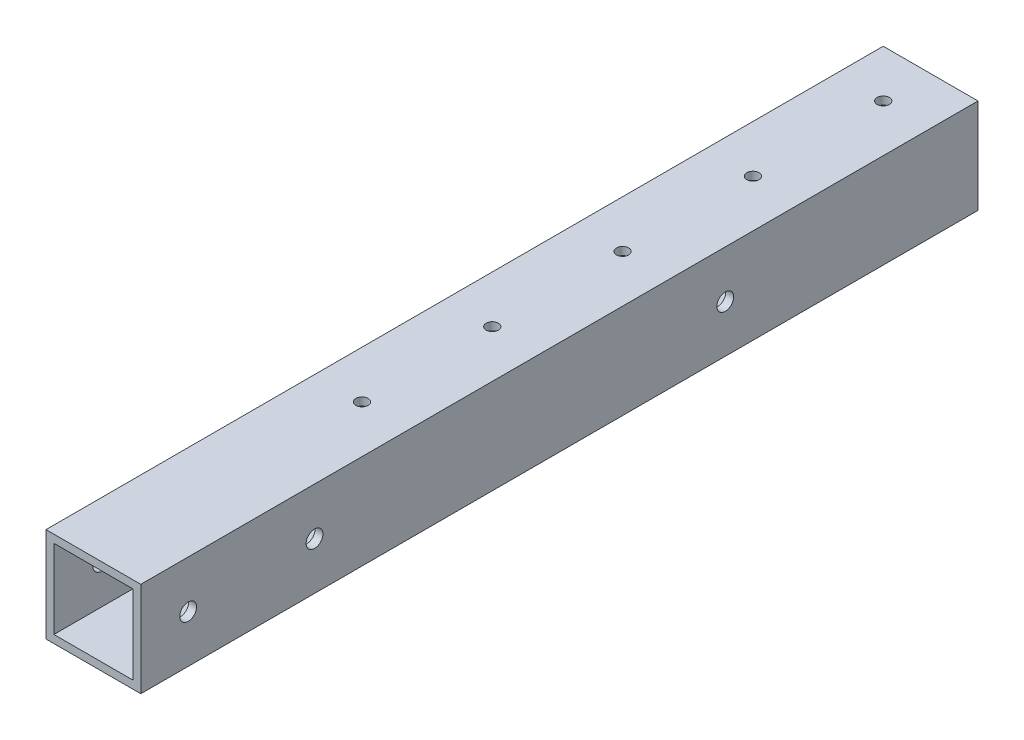
ISO-10303-21;
HEADER;
FILE_DESCRIPTION(('STEP AP214'),'2;1');
FILE_NAME('part.step','',(''),(''),'','','');
FILE_SCHEMA(('AUTOMOTIVE_DESIGN { 1 0 10303 214 1 1 1 1 }'));
ENDSEC;
DATA;
#1=APPLICATION_CONTEXT('core data for automotive mechanical design processes');
#2=APPLICATION_PROTOCOL_DEFINITION('international standard','automotive_design',2000,#1);
#3=PRODUCT_CONTEXT('',#1,'mechanical');
#4=PRODUCT('Part','Part','',(#3));
#5=PRODUCT_RELATED_PRODUCT_CATEGORY('part','',(#4));
#6=PRODUCT_DEFINITION_FORMATION('','',#4);
#7=PRODUCT_DEFINITION_CONTEXT('part definition',#1,'design');
#8=PRODUCT_DEFINITION('design','',#6,#7);
#9=PRODUCT_DEFINITION_SHAPE('','',#8);
#10=(LENGTH_UNIT() NAMED_UNIT(*) SI_UNIT(.MILLI.,.METRE.));
#11=(NAMED_UNIT(*) PLANE_ANGLE_UNIT() SI_UNIT($,.RADIAN.));
#12=(NAMED_UNIT(*) SI_UNIT($,.STERADIAN.) SOLID_ANGLE_UNIT());
#13=UNCERTAINTY_MEASURE_WITH_UNIT(LENGTH_MEASURE(1.E-05),#10,'distance_accuracy_value','');
#14=(GEOMETRIC_REPRESENTATION_CONTEXT(3) GLOBAL_UNCERTAINTY_ASSIGNED_CONTEXT((#13)) GLOBAL_UNIT_ASSIGNED_CONTEXT((#10,
#11,#12)) REPRESENTATION_CONTEXT('',''));
#15=CARTESIAN_POINT('',(0.,0.,0.));
#16=DIRECTION('',(0.,0.,1.));
#17=DIRECTION('',(1.,0.,0.));
#18=AXIS2_PLACEMENT_3D('',#15,#16,#17);
#19=CARTESIAN_POINT('',(19.05,-19.05,-171.45));
#20=DIRECTION('',(1.,0.,0.));
#21=DIRECTION('',(0.,0.,-1.));
#22=AXIS2_PLACEMENT_3D('',#19,#20,#21);
#23=PLANE('',#22);
#24=CARTESIAN_POINT('',(19.05,0.,146.05));
#25=DIRECTION('',(1.,0.,0.));
#26=DIRECTION('',(0.,0.,-1.));
#27=AXIS2_PLACEMENT_3D('',#24,#25,#26);
#28=CIRCLE('',#27,3.37819999999999);
#29=CARTESIAN_POINT('',(19.05,0.,142.6718));
#30=VERTEX_POINT('',#29);
#31=EDGE_CURVE('E284',#30,#30,#28,.T.);
#32=ORIENTED_EDGE('',*,*,#31,.F.);
#33=EDGE_LOOP('',(#32));
#34=FACE_BOUND('',#33,.T.);
#35=CARTESIAN_POINT('',(19.05,0.,-69.85));
#36=DIRECTION('',(1.,0.,0.));
#37=DIRECTION('',(0.,0.,-1.));
#38=AXIS2_PLACEMENT_3D('',#35,#36,#37);
#39=CIRCLE('',#38,3.37819999999999);
#40=CARTESIAN_POINT('',(19.05,0.,-73.2282));
#41=VERTEX_POINT('',#40);
#42=EDGE_CURVE('E294',#41,#41,#39,.T.);
#43=ORIENTED_EDGE('',*,*,#42,.F.);
#44=EDGE_LOOP('',(#43));
#45=FACE_BOUND('',#44,.T.);
#46=CARTESIAN_POINT('',(19.05,0.,95.25));
#47=DIRECTION('',(1.,0.,0.));
#48=DIRECTION('',(0.,0.,-1.));
#49=AXIS2_PLACEMENT_3D('',#46,#47,#48);
#50=CIRCLE('',#49,3.37819999999999);
#51=CARTESIAN_POINT('',(19.05,0.,91.8718));
#52=VERTEX_POINT('',#51);
#53=EDGE_CURVE('E304',#52,#52,#50,.T.);
#54=ORIENTED_EDGE('',*,*,#53,.F.);
#55=EDGE_LOOP('',(#54));
#56=FACE_BOUND('',#55,.T.);
#57=DIRECTION('',(0.,0.,1.));
#58=VECTOR('',#57,1.);
#59=CARTESIAN_POINT('',(19.05,19.05,-171.45));
#60=LINE('',#59,#58);
#61=CARTESIAN_POINT('',(19.05,19.05,-171.45));
#62=VERTEX_POINT('',#61);
#63=CARTESIAN_POINT('',(19.05,19.05,165.1));
#64=VERTEX_POINT('',#63);
#65=EDGE_CURVE('E187',#62,#64,#60,.T.);
#66=ORIENTED_EDGE('',*,*,#65,.T.);
#67=DIRECTION('',(0.,1.,0.));
#68=VECTOR('',#67,1.);
#69=CARTESIAN_POINT('',(19.05,-19.05,165.1));
#70=LINE('',#69,#68);
#71=CARTESIAN_POINT('',(19.05,-19.05,165.1));
#72=VERTEX_POINT('',#71);
#73=EDGE_CURVE('E140',#72,#64,#70,.T.);
#74=ORIENTED_EDGE('',*,*,#73,.F.);
#75=DIRECTION('',(0.,0.,1.));
#76=VECTOR('',#75,1.);
#77=CARTESIAN_POINT('',(19.05,-19.05,-171.45));
#78=LINE('',#77,#76);
#79=CARTESIAN_POINT('',(19.05,-19.05,-171.45));
#80=VERTEX_POINT('',#79);
#81=EDGE_CURVE('E11',#80,#72,#78,.T.);
#82=ORIENTED_EDGE('',*,*,#81,.F.);
#83=DIRECTION('',(0.,1.,0.));
#84=VECTOR('',#83,1.);
#85=CARTESIAN_POINT('',(19.05,-19.05,-171.45));
#86=LINE('',#85,#84);
#87=EDGE_CURVE('E168',#80,#62,#86,.T.);
#88=ORIENTED_EDGE('',*,*,#87,.T.);
#89=EDGE_LOOP('',(#66,#74,#82,#88));
#90=FACE_BOUND('',#89,.T.);
#91=ADVANCED_FACE('F36',(#34,#45,#56,#90),#23,.T.);
#92=CARTESIAN_POINT('',(-19.05,-19.05,-171.45));
#93=DIRECTION('',(0.,-1.,0.));
#94=DIRECTION('',(0.,0.,-1.));
#95=AXIS2_PLACEMENT_3D('',#92,#93,#94);
#96=PLANE('',#95);
#97=CARTESIAN_POINT('',(0.,-19.05,-152.4));
#98=DIRECTION('',(0.,1.,0.));
#99=DIRECTION('',(0.,0.,1.));
#100=AXIS2_PLACEMENT_3D('',#97,#98,#99);
#101=CIRCLE('',#100,2.45744999999998);
#102=CARTESIAN_POINT('',(0.,-19.05,-149.94255));
#103=VERTEX_POINT('',#102);
#104=EDGE_CURVE('E531',#103,#103,#101,.T.);
#105=ORIENTED_EDGE('',*,*,#104,.T.);
#106=EDGE_LOOP('',(#105));
#107=FACE_BOUND('',#106,.T.);
#108=CARTESIAN_POINT('',(1.73472347597681E-13,-19.05,-100.0125));
#109=DIRECTION('',(0.,1.,0.));
#110=DIRECTION('',(0.,0.,1.));
#111=AXIS2_PLACEMENT_3D('',#108,#109,#110);
#112=CIRCLE('',#111,2.45744999999998);
#113=CARTESIAN_POINT('',(1.73472347597681E-13,-19.05,-97.55505));
#114=VERTEX_POINT('',#113);
#115=EDGE_CURVE('E234',#114,#114,#112,.T.);
#116=ORIENTED_EDGE('',*,*,#115,.T.);
#117=EDGE_LOOP('',(#116));
#118=FACE_BOUND('',#117,.T.);
#119=CARTESIAN_POINT('',(0.,-19.05,-47.6249999999998));
#120=DIRECTION('',(0.,1.,0.));
#121=DIRECTION('',(0.,0.,1.));
#122=AXIS2_PLACEMENT_3D('',#119,#120,#121);
#123=CIRCLE('',#122,2.45744999999998);
#124=CARTESIAN_POINT('',(0.,-19.05,-45.1675499999998));
#125=VERTEX_POINT('',#124);
#126=EDGE_CURVE('E229',#125,#125,#123,.T.);
#127=ORIENTED_EDGE('',*,*,#126,.T.);
#128=EDGE_LOOP('',(#127));
#129=FACE_BOUND('',#128,.T.);
#130=CARTESIAN_POINT('',(1.31838984174237E-13,-19.05,4.76249999999998));
#131=DIRECTION('',(0.,1.,0.));
#132=DIRECTION('',(0.,0.,1.));
#133=AXIS2_PLACEMENT_3D('',#130,#131,#132);
#134=CIRCLE('',#133,2.45744999999998);
#135=CARTESIAN_POINT('',(1.31838984174237E-13,-19.05,7.21994999999996));
#136=VERTEX_POINT('',#135);
#137=EDGE_CURVE('E224',#136,#136,#134,.T.);
#138=ORIENTED_EDGE('',*,*,#137,.T.);
#139=EDGE_LOOP('',(#138));
#140=FACE_BOUND('',#139,.T.);
#141=CARTESIAN_POINT('',(0.,-19.05,57.15));
#142=DIRECTION('',(0.,1.,0.));
#143=DIRECTION('',(0.,0.,1.));
#144=AXIS2_PLACEMENT_3D('',#141,#142,#143);
#145=CIRCLE('',#144,2.45744999999998);
#146=CARTESIAN_POINT('',(0.,-19.05,59.60745));
#147=VERTEX_POINT('',#146);
#148=EDGE_CURVE('E218',#147,#147,#145,.T.);
#149=ORIENTED_EDGE('',*,*,#148,.T.);
#150=EDGE_LOOP('',(#149));
#151=FACE_BOUND('',#150,.T.);
#152=ORIENTED_EDGE('',*,*,#81,.T.);
#153=DIRECTION('',(1.,0.,0.));
#154=VECTOR('',#153,1.);
#155=CARTESIAN_POINT('',(-19.05,-19.05,165.1));
#156=LINE('',#155,#154);
#157=CARTESIAN_POINT('',(-19.05,-19.05,165.1));
#158=VERTEX_POINT('',#157);
#159=EDGE_CURVE('E152',#158,#72,#156,.T.);
#160=ORIENTED_EDGE('',*,*,#159,.F.);
#161=DIRECTION('',(0.,0.,1.));
#162=VECTOR('',#161,1.);
#163=CARTESIAN_POINT('',(-19.05,-19.05,-171.45));
#164=LINE('',#163,#162);
#165=CARTESIAN_POINT('',(-19.05,-19.05,-171.45));
#166=VERTEX_POINT('',#165);
#167=EDGE_CURVE('E45',#166,#158,#164,.T.);
#168=ORIENTED_EDGE('',*,*,#167,.F.);
#169=DIRECTION('',(1.,0.,0.));
#170=VECTOR('',#169,1.);
#171=CARTESIAN_POINT('',(-19.05,-19.05,-171.45));
#172=LINE('',#171,#170);
#173=EDGE_CURVE('E184',#166,#80,#172,.T.);
#174=ORIENTED_EDGE('',*,*,#173,.T.);
#175=EDGE_LOOP('',(#152,#160,#168,#174));
#176=FACE_BOUND('',#175,.T.);
#177=ADVANCED_FACE('F332',(#107,#118,#129,#140,#151,#176),#96,.T.);
#178=CARTESIAN_POINT('',(-19.05,-19.05,-171.45));
#179=DIRECTION('',(-1.,0.,0.));
#180=DIRECTION('',(0.,0.,1.));
#181=AXIS2_PLACEMENT_3D('',#178,#179,#180);
#182=PLANE('',#181);
#183=CARTESIAN_POINT('',(-19.05,0.,146.05));
#184=DIRECTION('',(1.,0.,0.));
#185=DIRECTION('',(0.,0.,-1.));
#186=AXIS2_PLACEMENT_3D('',#183,#184,#185);
#187=CIRCLE('',#186,3.37819999999999);
#188=CARTESIAN_POINT('',(-19.05,0.,142.6718));
#189=VERTEX_POINT('',#188);
#190=EDGE_CURVE('E212',#189,#189,#187,.T.);
#191=ORIENTED_EDGE('',*,*,#190,.T.);
#192=EDGE_LOOP('',(#191));
#193=FACE_BOUND('',#192,.T.);
#194=CARTESIAN_POINT('',(-19.05,0.,-69.85));
#195=DIRECTION('',(1.,0.,0.));
#196=DIRECTION('',(0.,0.,-1.));
#197=AXIS2_PLACEMENT_3D('',#194,#195,#196);
#198=CIRCLE('',#197,3.37819999999999);
#199=CARTESIAN_POINT('',(-19.05,0.,-73.2282));
#200=VERTEX_POINT('',#199);
#201=EDGE_CURVE('E206',#200,#200,#198,.T.);
#202=ORIENTED_EDGE('',*,*,#201,.T.);
#203=EDGE_LOOP('',(#202));
#204=FACE_BOUND('',#203,.T.);
#205=CARTESIAN_POINT('',(-19.05,0.,95.25));
#206=DIRECTION('',(1.,0.,0.));
#207=DIRECTION('',(0.,0.,-1.));
#208=AXIS2_PLACEMENT_3D('',#205,#206,#207);
#209=CIRCLE('',#208,3.37819999999999);
#210=CARTESIAN_POINT('',(-19.05,0.,91.8718));
#211=VERTEX_POINT('',#210);
#212=EDGE_CURVE('E200',#211,#211,#209,.T.);
#213=ORIENTED_EDGE('',*,*,#212,.T.);
#214=EDGE_LOOP('',(#213));
#215=FACE_BOUND('',#214,.T.);
#216=ORIENTED_EDGE('',*,*,#167,.T.);
#217=DIRECTION('',(0.,-1.,0.));
#218=VECTOR('',#217,1.);
#219=CARTESIAN_POINT('',(-19.05,-19.05,165.1));
#220=LINE('',#219,#218);
#221=CARTESIAN_POINT('',(-19.05,19.05,165.1));
#222=VERTEX_POINT('',#221);
#223=EDGE_CURVE('E148',#222,#158,#220,.T.);
#224=ORIENTED_EDGE('',*,*,#223,.F.);
#225=DIRECTION('',(0.,0.,1.));
#226=VECTOR('',#225,1.);
#227=CARTESIAN_POINT('',(-19.05,19.05,-171.45));
#228=LINE('',#227,#226);
#229=CARTESIAN_POINT('',(-19.05,19.05,-171.45));
#230=VERTEX_POINT('',#229);
#231=EDGE_CURVE('E191',#230,#222,#228,.T.);
#232=ORIENTED_EDGE('',*,*,#231,.F.);
#233=DIRECTION('',(0.,-1.,0.));
#234=VECTOR('',#233,1.);
#235=CARTESIAN_POINT('',(-19.05,-19.05,-171.45));
#236=LINE('',#235,#234);
#237=EDGE_CURVE('E180',#230,#166,#236,.T.);
#238=ORIENTED_EDGE('',*,*,#237,.T.);
#239=EDGE_LOOP('',(#216,#224,#232,#238));
#240=FACE_BOUND('',#239,.T.);
#241=ADVANCED_FACE('F337',(#193,#204,#215,#240),#182,.T.);
#242=CARTESIAN_POINT('',(-19.05,19.05,-171.45));
#243=DIRECTION('',(0.,1.,0.));
#244=DIRECTION('',(0.,0.,1.));
#245=AXIS2_PLACEMENT_3D('',#242,#243,#244);
#246=PLANE('',#245);
#247=CARTESIAN_POINT('',(0.,19.05,-152.4));
#248=DIRECTION('',(0.,1.,0.));
#249=DIRECTION('',(0.,0.,1.));
#250=AXIS2_PLACEMENT_3D('',#247,#248,#249);
#251=CIRCLE('',#250,2.45744999999999);
#252=CARTESIAN_POINT('',(0.,19.05,-149.94255));
#253=VERTEX_POINT('',#252);
#254=EDGE_CURVE('E541',#253,#253,#251,.T.);
#255=ORIENTED_EDGE('',*,*,#254,.F.);
#256=EDGE_LOOP('',(#255));
#257=FACE_BOUND('',#256,.T.);
#258=CARTESIAN_POINT('',(1.73472347597681E-13,19.05,-100.0125));
#259=DIRECTION('',(0.,1.,0.));
#260=DIRECTION('',(0.,0.,1.));
#261=AXIS2_PLACEMENT_3D('',#258,#259,#260);
#262=CIRCLE('',#261,2.45744999999999);
#263=CARTESIAN_POINT('',(1.73472347597681E-13,19.05,-97.55505));
#264=VERTEX_POINT('',#263);
#265=EDGE_CURVE('E244',#264,#264,#262,.T.);
#266=ORIENTED_EDGE('',*,*,#265,.F.);
#267=EDGE_LOOP('',(#266));
#268=FACE_BOUND('',#267,.T.);
#269=CARTESIAN_POINT('',(0.,19.05,-47.6249999999998));
#270=DIRECTION('',(0.,1.,0.));
#271=DIRECTION('',(0.,0.,1.));
#272=AXIS2_PLACEMENT_3D('',#269,#270,#271);
#273=CIRCLE('',#272,2.45744999999999);
#274=CARTESIAN_POINT('',(0.,19.05,-45.1675499999998));
#275=VERTEX_POINT('',#274);
#276=EDGE_CURVE('E241',#275,#275,#273,.T.);
#277=ORIENTED_EDGE('',*,*,#276,.F.);
#278=EDGE_LOOP('',(#277));
#279=FACE_BOUND('',#278,.T.);
#280=CARTESIAN_POINT('',(1.31838984174237E-13,19.05,4.76249999999998));
#281=DIRECTION('',(0.,1.,0.));
#282=DIRECTION('',(0.,0.,1.));
#283=AXIS2_PLACEMENT_3D('',#280,#281,#282);
#284=CIRCLE('',#283,2.45744999999999);
#285=CARTESIAN_POINT('',(1.31838984174237E-13,19.05,7.21994999999996));
#286=VERTEX_POINT('',#285);
#287=EDGE_CURVE('E264',#286,#286,#284,.T.);
#288=ORIENTED_EDGE('',*,*,#287,.F.);
#289=EDGE_LOOP('',(#288));
#290=FACE_BOUND('',#289,.T.);
#291=CARTESIAN_POINT('',(0.,19.05,57.15));
#292=DIRECTION('',(0.,1.,0.));
#293=DIRECTION('',(0.,0.,1.));
#294=AXIS2_PLACEMENT_3D('',#291,#292,#293);
#295=CIRCLE('',#294,2.45744999999999);
#296=CARTESIAN_POINT('',(0.,19.05,59.60745));
#297=VERTEX_POINT('',#296);
#298=EDGE_CURVE('E274',#297,#297,#295,.T.);
#299=ORIENTED_EDGE('',*,*,#298,.F.);
#300=EDGE_LOOP('',(#299));
#301=FACE_BOUND('',#300,.T.);
#302=ORIENTED_EDGE('',*,*,#231,.T.);
#303=DIRECTION('',(-1.,0.,0.));
#304=VECTOR('',#303,1.);
#305=CARTESIAN_POINT('',(-19.05,19.05,165.1));
#306=LINE('',#305,#304);
#307=EDGE_CURVE('E144',#64,#222,#306,.T.);
#308=ORIENTED_EDGE('',*,*,#307,.F.);
#309=ORIENTED_EDGE('',*,*,#65,.F.);
#310=DIRECTION('',(-1.,0.,0.));
#311=VECTOR('',#310,1.);
#312=CARTESIAN_POINT('',(-19.05,19.05,-171.45));
#313=LINE('',#312,#311);
#314=EDGE_CURVE('E176',#62,#230,#313,.T.);
#315=ORIENTED_EDGE('',*,*,#314,.T.);
#316=EDGE_LOOP('',(#302,#308,#309,#315));
#317=FACE_BOUND('',#316,.T.);
#318=ADVANCED_FACE('F348',(#257,#268,#279,#290,#301,#317),#246,.T.);
#319=CARTESIAN_POINT('',(0.,0.,-171.45));
#320=DIRECTION('',(0.,0.,-1.));
#321=DIRECTION('',(-1.,0.,0.));
#322=AXIS2_PLACEMENT_3D('',#319,#320,#321);
#323=PLANE('',#322);
#324=DIRECTION('',(0.,1.,0.));
#325=VECTOR('',#324,1.);
#326=CARTESIAN_POINT('',(15.875,-15.875,-171.45));
#327=LINE('',#326,#325);
#328=CARTESIAN_POINT('',(15.875,-15.875,-171.45));
#329=VERTEX_POINT('',#328);
#330=CARTESIAN_POINT('',(15.875,15.875,-171.45));
#331=VERTEX_POINT('',#330);
#332=EDGE_CURVE('E156',#329,#331,#327,.T.);
#333=ORIENTED_EDGE('',*,*,#332,.T.);
#334=DIRECTION('',(-1.,0.,0.));
#335=VECTOR('',#334,1.);
#336=CARTESIAN_POINT('',(-15.875,15.875,-171.45));
#337=LINE('',#336,#335);
#338=CARTESIAN_POINT('',(-15.875,15.875,-171.45));
#339=VERTEX_POINT('',#338);
#340=EDGE_CURVE('E109',#331,#339,#337,.T.);
#341=ORIENTED_EDGE('',*,*,#340,.T.);
#342=DIRECTION('',(0.,-1.,0.));
#343=VECTOR('',#342,1.);
#344=CARTESIAN_POINT('',(-15.875,-15.875,-171.45));
#345=LINE('',#344,#343);
#346=CARTESIAN_POINT('',(-15.875,-15.875,-171.45));
#347=VERTEX_POINT('',#346);
#348=EDGE_CURVE('E53',#339,#347,#345,.T.);
#349=ORIENTED_EDGE('',*,*,#348,.T.);
#350=DIRECTION('',(1.,0.,0.));
#351=VECTOR('',#350,1.);
#352=CARTESIAN_POINT('',(-15.875,-15.875,-171.45));
#353=LINE('',#352,#351);
#354=EDGE_CURVE('E115',#347,#329,#353,.T.);
#355=ORIENTED_EDGE('',*,*,#354,.T.);
#356=EDGE_LOOP('',(#333,#341,#349,#355));
#357=FACE_BOUND('',#356,.T.);
#358=ORIENTED_EDGE('',*,*,#87,.F.);
#359=ORIENTED_EDGE('',*,*,#173,.F.);
#360=ORIENTED_EDGE('',*,*,#237,.F.);
#361=ORIENTED_EDGE('',*,*,#314,.F.);
#362=EDGE_LOOP('',(#358,#359,#360,#361));
#363=FACE_BOUND('',#362,.T.);
#364=ADVANCED_FACE('F356',(#357,#363),#323,.T.);
#365=CARTESIAN_POINT('',(15.875,-15.875,-171.45));
#366=DIRECTION('',(1.,0.,0.));
#367=DIRECTION('',(0.,0.,-1.));
#368=AXIS2_PLACEMENT_3D('',#365,#366,#367);
#369=PLANE('',#368);
#370=CARTESIAN_POINT('',(15.875,0.,146.05));
#371=DIRECTION('',(1.,0.,0.));
#372=DIRECTION('',(0.,0.,-1.));
#373=AXIS2_PLACEMENT_3D('',#370,#371,#372);
#374=CIRCLE('',#373,3.37819999999999);
#375=CARTESIAN_POINT('',(15.875,0.,142.6718));
#376=VERTEX_POINT('',#375);
#377=EDGE_CURVE('E211',#376,#376,#374,.T.);
#378=ORIENTED_EDGE('',*,*,#377,.T.);
#379=EDGE_LOOP('',(#378));
#380=FACE_BOUND('',#379,.T.);
#381=CARTESIAN_POINT('',(15.875,0.,-69.85));
#382=DIRECTION('',(1.,0.,0.));
#383=DIRECTION('',(0.,0.,-1.));
#384=AXIS2_PLACEMENT_3D('',#381,#382,#383);
#385=CIRCLE('',#384,3.37819999999999);
#386=CARTESIAN_POINT('',(15.875,0.,-73.2282));
#387=VERTEX_POINT('',#386);
#388=EDGE_CURVE('E201',#387,#387,#385,.T.);
#389=ORIENTED_EDGE('',*,*,#388,.T.);
#390=EDGE_LOOP('',(#389));
#391=FACE_BOUND('',#390,.T.);
#392=CARTESIAN_POINT('',(15.875,0.,95.25));
#393=DIRECTION('',(1.,0.,0.));
#394=DIRECTION('',(0.,0.,-1.));
#395=AXIS2_PLACEMENT_3D('',#392,#393,#394);
#396=CIRCLE('',#395,3.37819999999999);
#397=CARTESIAN_POINT('',(15.875,0.,91.8718));
#398=VERTEX_POINT('',#397);
#399=EDGE_CURVE('E125',#398,#398,#396,.T.);
#400=ORIENTED_EDGE('',*,*,#399,.T.);
#401=EDGE_LOOP('',(#400));
#402=FACE_BOUND('',#401,.T.);
#403=DIRECTION('',(0.,0.,1.));
#404=VECTOR('',#403,1.);
#405=CARTESIAN_POINT('',(15.875,-15.875,-171.45));
#406=LINE('',#405,#404);
#407=CARTESIAN_POINT('',(15.875,-15.875,165.1));
#408=VERTEX_POINT('',#407);
#409=EDGE_CURVE('E120',#329,#408,#406,.T.);
#410=ORIENTED_EDGE('',*,*,#409,.T.);
#411=DIRECTION('',(0.,1.,0.));
#412=VECTOR('',#411,1.);
#413=CARTESIAN_POINT('',(15.875,-15.875,165.1));
#414=LINE('',#413,#412);
#415=CARTESIAN_POINT('',(15.875,15.875,165.1));
#416=VERTEX_POINT('',#415);
#417=EDGE_CURVE('E118',#408,#416,#414,.T.);
#418=ORIENTED_EDGE('',*,*,#417,.T.);
#419=DIRECTION('',(0.,0.,1.));
#420=VECTOR('',#419,1.);
#421=CARTESIAN_POINT('',(15.875,15.875,-171.45));
#422=LINE('',#421,#420);
#423=EDGE_CURVE('E102',#331,#416,#422,.T.);
#424=ORIENTED_EDGE('',*,*,#423,.F.);
#425=ORIENTED_EDGE('',*,*,#332,.F.);
#426=EDGE_LOOP('',(#410,#418,#424,#425));
#427=FACE_BOUND('',#426,.T.);
#428=ADVANCED_FACE('F119',(#380,#391,#402,#427),#369,.F.);
#429=CARTESIAN_POINT('',(-15.875,-15.875,-171.45));
#430=DIRECTION('',(0.,-1.,0.));
#431=DIRECTION('',(0.,0.,-1.));
#432=AXIS2_PLACEMENT_3D('',#429,#430,#431);
#433=PLANE('',#432);
#434=CARTESIAN_POINT('',(0.,-15.875,-152.4));
#435=DIRECTION('',(0.,-1.,0.));
#436=DIRECTION('',(0.,0.,-1.));
#437=AXIS2_PLACEMENT_3D('',#434,#435,#436);
#438=CIRCLE('',#437,2.45744999999999);
#439=CARTESIAN_POINT('',(0.,-15.875,-154.85745));
#440=VERTEX_POINT('',#439);
#441=EDGE_CURVE('E251',#440,#440,#438,.T.);
#442=ORIENTED_EDGE('',*,*,#441,.T.);
#443=EDGE_LOOP('',(#442));
#444=FACE_BOUND('',#443,.T.);
#445=CARTESIAN_POINT('',(1.73472347597681E-13,-15.875,-100.0125));
#446=DIRECTION('',(0.,-1.,0.));
#447=DIRECTION('',(0.,0.,-1.));
#448=AXIS2_PLACEMENT_3D('',#445,#446,#447);
#449=CIRCLE('',#448,2.45744999999999);
#450=CARTESIAN_POINT('',(1.73472347597681E-13,-15.875,-102.46995));
#451=VERTEX_POINT('',#450);
#452=EDGE_CURVE('E233',#451,#451,#449,.T.);
#453=ORIENTED_EDGE('',*,*,#452,.T.);
#454=EDGE_LOOP('',(#453));
#455=FACE_BOUND('',#454,.T.);
#456=CARTESIAN_POINT('',(0.,-15.875,-47.6249999999998));
#457=DIRECTION('',(0.,-1.,0.));
#458=DIRECTION('',(0.,0.,-1.));
#459=AXIS2_PLACEMENT_3D('',#456,#457,#458);
#460=CIRCLE('',#459,2.45744999999999);
#461=CARTESIAN_POINT('',(0.,-15.875,-50.0824499999998));
#462=VERTEX_POINT('',#461);
#463=EDGE_CURVE('E228',#462,#462,#460,.T.);
#464=ORIENTED_EDGE('',*,*,#463,.T.);
#465=EDGE_LOOP('',(#464));
#466=FACE_BOUND('',#465,.T.);
#467=CARTESIAN_POINT('',(1.31838984174237E-13,-15.875,4.76249999999998));
#468=DIRECTION('',(0.,-1.,0.));
#469=DIRECTION('',(0.,0.,-1.));
#470=AXIS2_PLACEMENT_3D('',#467,#468,#469);
#471=CIRCLE('',#470,2.45744999999999);
#472=CARTESIAN_POINT('',(1.31838984174237E-13,-15.875,2.30504999999999));
#473=VERTEX_POINT('',#472);
#474=EDGE_CURVE('E223',#473,#473,#471,.T.);
#475=ORIENTED_EDGE('',*,*,#474,.T.);
#476=EDGE_LOOP('',(#475));
#477=FACE_BOUND('',#476,.T.);
#478=CARTESIAN_POINT('',(0.,-15.875,57.15));
#479=DIRECTION('',(0.,-1.,0.));
#480=DIRECTION('',(0.,0.,-1.));
#481=AXIS2_PLACEMENT_3D('',#478,#479,#480);
#482=CIRCLE('',#481,2.45744999999999);
#483=CARTESIAN_POINT('',(0.,-15.875,54.69255));
#484=VERTEX_POINT('',#483);
#485=EDGE_CURVE('E217',#484,#484,#482,.T.);
#486=ORIENTED_EDGE('',*,*,#485,.T.);
#487=EDGE_LOOP('',(#486));
#488=FACE_BOUND('',#487,.T.);
#489=DIRECTION('',(0.,0.,1.));
#490=VECTOR('',#489,1.);
#491=CARTESIAN_POINT('',(-15.875,-15.875,-171.45));
#492=LINE('',#491,#490);
#493=CARTESIAN_POINT('',(-15.875,-15.875,165.1));
#494=VERTEX_POINT('',#493);
#495=EDGE_CURVE('E169',#347,#494,#492,.T.);
#496=ORIENTED_EDGE('',*,*,#495,.T.);
#497=DIRECTION('',(1.,0.,0.));
#498=VECTOR('',#497,1.);
#499=CARTESIAN_POINT('',(-15.875,-15.875,165.1));
#500=LINE('',#499,#498);
#501=EDGE_CURVE('E134',#494,#408,#500,.T.);
#502=ORIENTED_EDGE('',*,*,#501,.T.);
#503=ORIENTED_EDGE('',*,*,#409,.F.);
#504=ORIENTED_EDGE('',*,*,#354,.F.);
#505=EDGE_LOOP('',(#496,#502,#503,#504));
#506=FACE_BOUND('',#505,.T.);
#507=ADVANCED_FACE('F372',(#444,#455,#466,#477,#488,#506),#433,.F.);
#508=CARTESIAN_POINT('',(-15.875,-15.875,-171.45));
#509=DIRECTION('',(-1.,0.,0.));
#510=DIRECTION('',(0.,0.,1.));
#511=AXIS2_PLACEMENT_3D('',#508,#509,#510);
#512=PLANE('',#511);
#513=CARTESIAN_POINT('',(-15.875,0.,146.05));
#514=DIRECTION('',(-1.,0.,0.));
#515=DIRECTION('',(0.,0.,1.));
#516=AXIS2_PLACEMENT_3D('',#513,#514,#515);
#517=CIRCLE('',#516,3.37819999999999);
#518=CARTESIAN_POINT('',(-15.875,0.,149.4282));
#519=VERTEX_POINT('',#518);
#520=EDGE_CURVE('E207',#519,#519,#517,.T.);
#521=ORIENTED_EDGE('',*,*,#520,.T.);
#522=EDGE_LOOP('',(#521));
#523=FACE_BOUND('',#522,.T.);
#524=CARTESIAN_POINT('',(-15.875,0.,-69.85));
#525=DIRECTION('',(-1.,0.,0.));
#526=DIRECTION('',(0.,0.,1.));
#527=AXIS2_PLACEMENT_3D('',#524,#525,#526);
#528=CIRCLE('',#527,3.37819999999999);
#529=CARTESIAN_POINT('',(-15.875,0.,-66.4718));
#530=VERTEX_POINT('',#529);
#531=EDGE_CURVE('E205',#530,#530,#528,.T.);
#532=ORIENTED_EDGE('',*,*,#531,.T.);
#533=EDGE_LOOP('',(#532));
#534=FACE_BOUND('',#533,.T.);
#535=CARTESIAN_POINT('',(-15.875,0.,95.25));
#536=DIRECTION('',(-1.,0.,0.));
#537=DIRECTION('',(0.,0.,1.));
#538=AXIS2_PLACEMENT_3D('',#535,#536,#537);
#539=CIRCLE('',#538,3.37819999999999);
#540=CARTESIAN_POINT('',(-15.875,0.,98.6282));
#541=VERTEX_POINT('',#540);
#542=EDGE_CURVE('E196',#541,#541,#539,.T.);
#543=ORIENTED_EDGE('',*,*,#542,.T.);
#544=EDGE_LOOP('',(#543));
#545=FACE_BOUND('',#544,.T.);
#546=DIRECTION('',(0.,0.,1.));
#547=VECTOR('',#546,1.);
#548=CARTESIAN_POINT('',(-15.875,15.875,-171.45));
#549=LINE('',#548,#547);
#550=CARTESIAN_POINT('',(-15.875,15.875,165.1));
#551=VERTEX_POINT('',#550);
#552=EDGE_CURVE('E114',#339,#551,#549,.T.);
#553=ORIENTED_EDGE('',*,*,#552,.T.);
#554=DIRECTION('',(0.,-1.,0.));
#555=VECTOR('',#554,1.);
#556=CARTESIAN_POINT('',(-15.875,-15.875,165.1));
#557=LINE('',#556,#555);
#558=EDGE_CURVE('E129',#551,#494,#557,.T.);
#559=ORIENTED_EDGE('',*,*,#558,.T.);
#560=ORIENTED_EDGE('',*,*,#495,.F.);
#561=ORIENTED_EDGE('',*,*,#348,.F.);
#562=EDGE_LOOP('',(#553,#559,#560,#561));
#563=FACE_BOUND('',#562,.T.);
#564=ADVANCED_FACE('F376',(#523,#534,#545,#563),#512,.F.);
#565=CARTESIAN_POINT('',(-15.875,15.875,-171.45));
#566=DIRECTION('',(0.,1.,0.));
#567=DIRECTION('',(0.,0.,1.));
#568=AXIS2_PLACEMENT_3D('',#565,#566,#567);
#569=PLANE('',#568);
#570=CARTESIAN_POINT('',(0.,15.875,-152.4));
#571=DIRECTION('',(0.,1.,0.));
#572=DIRECTION('',(0.,0.,1.));
#573=AXIS2_PLACEMENT_3D('',#570,#571,#572);
#574=CIRCLE('',#573,2.45744999999999);
#575=CARTESIAN_POINT('',(0.,15.875,-149.94255));
#576=VERTEX_POINT('',#575);
#577=EDGE_CURVE('E39',#576,#576,#574,.T.);
#578=ORIENTED_EDGE('',*,*,#577,.T.);
#579=EDGE_LOOP('',(#578));
#580=FACE_BOUND('',#579,.T.);
#581=CARTESIAN_POINT('',(1.73472347597681E-13,15.875,-100.0125));
#582=DIRECTION('',(0.,1.,0.));
#583=DIRECTION('',(0.,0.,1.));
#584=AXIS2_PLACEMENT_3D('',#581,#582,#583);
#585=CIRCLE('',#584,2.45744999999999);
#586=CARTESIAN_POINT('',(1.73472347597681E-13,15.875,-97.55505));
#587=VERTEX_POINT('',#586);
#588=EDGE_CURVE('E230',#587,#587,#585,.T.);
#589=ORIENTED_EDGE('',*,*,#588,.T.);
#590=EDGE_LOOP('',(#589));
#591=FACE_BOUND('',#590,.T.);
#592=CARTESIAN_POINT('',(0.,15.875,-47.6249999999998));
#593=DIRECTION('',(0.,1.,0.));
#594=DIRECTION('',(0.,0.,1.));
#595=AXIS2_PLACEMENT_3D('',#592,#593,#594);
#596=CIRCLE('',#595,2.45744999999999);
#597=CARTESIAN_POINT('',(0.,15.875,-45.1675499999998));
#598=VERTEX_POINT('',#597);
#599=EDGE_CURVE('E225',#598,#598,#596,.T.);
#600=ORIENTED_EDGE('',*,*,#599,.T.);
#601=EDGE_LOOP('',(#600));
#602=FACE_BOUND('',#601,.T.);
#603=CARTESIAN_POINT('',(1.31838984174237E-13,15.875,4.76249999999998));
#604=DIRECTION('',(0.,1.,0.));
#605=DIRECTION('',(0.,0.,1.));
#606=AXIS2_PLACEMENT_3D('',#603,#604,#605);
#607=CIRCLE('',#606,2.45744999999999);
#608=CARTESIAN_POINT('',(1.31838984174237E-13,15.875,7.21994999999996));
#609=VERTEX_POINT('',#608);
#610=EDGE_CURVE('E219',#609,#609,#607,.T.);
#611=ORIENTED_EDGE('',*,*,#610,.T.);
#612=EDGE_LOOP('',(#611));
#613=FACE_BOUND('',#612,.T.);
#614=CARTESIAN_POINT('',(0.,15.875,57.15));
#615=DIRECTION('',(0.,1.,0.));
#616=DIRECTION('',(0.,0.,1.));
#617=AXIS2_PLACEMENT_3D('',#614,#615,#616);
#618=CIRCLE('',#617,2.45744999999999);
#619=CARTESIAN_POINT('',(0.,15.875,59.60745));
#620=VERTEX_POINT('',#619);
#621=EDGE_CURVE('E213',#620,#620,#618,.T.);
#622=ORIENTED_EDGE('',*,*,#621,.T.);
#623=EDGE_LOOP('',(#622));
#624=FACE_BOUND('',#623,.T.);
#625=ORIENTED_EDGE('',*,*,#423,.T.);
#626=DIRECTION('',(-1.,0.,0.));
#627=VECTOR('',#626,1.);
#628=CARTESIAN_POINT('',(-15.875,15.875,165.1));
#629=LINE('',#628,#627);
#630=EDGE_CURVE('E106',#416,#551,#629,.T.);
#631=ORIENTED_EDGE('',*,*,#630,.T.);
#632=ORIENTED_EDGE('',*,*,#552,.F.);
#633=ORIENTED_EDGE('',*,*,#340,.F.);
#634=EDGE_LOOP('',(#625,#631,#632,#633));
#635=FACE_BOUND('',#634,.T.);
#636=ADVANCED_FACE('F104',(#580,#591,#602,#613,#624,#635),#569,.F.);
#637=CARTESIAN_POINT('',(0.,0.,165.1));
#638=DIRECTION('',(0.,0.,-1.));
#639=DIRECTION('',(-1.,0.,0.));
#640=AXIS2_PLACEMENT_3D('',#637,#638,#639);
#641=PLANE('',#640);
#642=ORIENTED_EDGE('',*,*,#73,.T.);
#643=ORIENTED_EDGE('',*,*,#307,.T.);
#644=ORIENTED_EDGE('',*,*,#223,.T.);
#645=ORIENTED_EDGE('',*,*,#159,.T.);
#646=EDGE_LOOP('',(#642,#643,#644,#645));
#647=FACE_BOUND('',#646,.T.);
#648=ORIENTED_EDGE('',*,*,#417,.F.);
#649=ORIENTED_EDGE('',*,*,#501,.F.);
#650=ORIENTED_EDGE('',*,*,#558,.F.);
#651=ORIENTED_EDGE('',*,*,#630,.F.);
#652=EDGE_LOOP('',(#648,#649,#650,#651));
#653=FACE_BOUND('',#652,.T.);
#654=ADVANCED_FACE('F127',(#647,#653),#641,.F.);
#655=CARTESIAN_POINT('',(19.05,0.,95.25));
#656=DIRECTION('',(1.,0.,0.));
#657=DIRECTION('',(0.,0.,-1.));
#658=AXIS2_PLACEMENT_3D('',#655,#656,#657);
#659=CYLINDRICAL_SURFACE('',#658,3.37819999999999);
#660=ORIENTED_EDGE('',*,*,#212,.F.);
#661=EDGE_LOOP('',(#660));
#662=FACE_BOUND('',#661,.T.);
#663=ORIENTED_EDGE('',*,*,#542,.F.);
#664=EDGE_LOOP('',(#663));
#665=FACE_BOUND('',#664,.T.);
#666=ADVANCED_FACE('F319',(#662,#665),#659,.F.);
#667=ORIENTED_EDGE('',*,*,#53,.T.);
#668=EDGE_LOOP('',(#667));
#669=FACE_BOUND('',#668,.T.);
#670=ORIENTED_EDGE('',*,*,#399,.F.);
#671=EDGE_LOOP('',(#670));
#672=FACE_BOUND('',#671,.T.);
#673=ADVANCED_FACE('F316',(#669,#672),#659,.F.);
#674=CARTESIAN_POINT('',(19.05,0.,-69.85));
#675=DIRECTION('',(1.,0.,0.));
#676=DIRECTION('',(0.,0.,-1.));
#677=AXIS2_PLACEMENT_3D('',#674,#675,#676);
#678=CYLINDRICAL_SURFACE('',#677,3.37819999999999);
#679=ORIENTED_EDGE('',*,*,#42,.T.);
#680=EDGE_LOOP('',(#679));
#681=FACE_BOUND('',#680,.T.);
#682=ORIENTED_EDGE('',*,*,#388,.F.);
#683=EDGE_LOOP('',(#682));
#684=FACE_BOUND('',#683,.T.);
#685=ADVANCED_FACE('F318',(#681,#684),#678,.F.);
#686=ORIENTED_EDGE('',*,*,#201,.F.);
#687=EDGE_LOOP('',(#686));
#688=FACE_BOUND('',#687,.T.);
#689=ORIENTED_EDGE('',*,*,#531,.F.);
#690=EDGE_LOOP('',(#689));
#691=FACE_BOUND('',#690,.T.);
#692=ADVANCED_FACE('F326',(#688,#691),#678,.F.);
#693=CARTESIAN_POINT('',(19.05,0.,146.05));
#694=DIRECTION('',(1.,0.,0.));
#695=DIRECTION('',(0.,0.,-1.));
#696=AXIS2_PLACEMENT_3D('',#693,#694,#695);
#697=CYLINDRICAL_SURFACE('',#696,3.37819999999999);
#698=ORIENTED_EDGE('',*,*,#190,.F.);
#699=EDGE_LOOP('',(#698));
#700=FACE_BOUND('',#699,.T.);
#701=ORIENTED_EDGE('',*,*,#520,.F.);
#702=EDGE_LOOP('',(#701));
#703=FACE_BOUND('',#702,.T.);
#704=ADVANCED_FACE('F411',(#700,#703),#697,.F.);
#705=ORIENTED_EDGE('',*,*,#31,.T.);
#706=EDGE_LOOP('',(#705));
#707=FACE_BOUND('',#706,.T.);
#708=ORIENTED_EDGE('',*,*,#377,.F.);
#709=EDGE_LOOP('',(#708));
#710=FACE_BOUND('',#709,.T.);
#711=ADVANCED_FACE('F420',(#707,#710),#697,.F.);
#712=CARTESIAN_POINT('',(0.,19.05,57.15));
#713=DIRECTION('',(0.,1.,0.));
#714=DIRECTION('',(0.,0.,1.));
#715=AXIS2_PLACEMENT_3D('',#712,#713,#714);
#716=CYLINDRICAL_SURFACE('',#715,2.45744999999999);
#717=ORIENTED_EDGE('',*,*,#298,.T.);
#718=EDGE_LOOP('',(#717));
#719=FACE_BOUND('',#718,.T.);
#720=ORIENTED_EDGE('',*,*,#621,.F.);
#721=EDGE_LOOP('',(#720));
#722=FACE_BOUND('',#721,.T.);
#723=ADVANCED_FACE('F430',(#719,#722),#716,.F.);
#724=ORIENTED_EDGE('',*,*,#148,.F.);
#725=EDGE_LOOP('',(#724));
#726=FACE_BOUND('',#725,.T.);
#727=ORIENTED_EDGE('',*,*,#485,.F.);
#728=EDGE_LOOP('',(#727));
#729=FACE_BOUND('',#728,.T.);
#730=ADVANCED_FACE('F439',(#726,#729),#716,.F.);
#731=CARTESIAN_POINT('',(1.31838984174237E-13,19.05,4.76249999999998));
#732=DIRECTION('',(0.,1.,0.));
#733=DIRECTION('',(0.,0.,1.));
#734=AXIS2_PLACEMENT_3D('',#731,#732,#733);
#735=CYLINDRICAL_SURFACE('',#734,2.45744999999999);
#736=ORIENTED_EDGE('',*,*,#287,.T.);
#737=EDGE_LOOP('',(#736));
#738=FACE_BOUND('',#737,.T.);
#739=ORIENTED_EDGE('',*,*,#610,.F.);
#740=EDGE_LOOP('',(#739));
#741=FACE_BOUND('',#740,.T.);
#742=ADVANCED_FACE('F449',(#738,#741),#735,.F.);
#743=ORIENTED_EDGE('',*,*,#137,.F.);
#744=EDGE_LOOP('',(#743));
#745=FACE_BOUND('',#744,.T.);
#746=ORIENTED_EDGE('',*,*,#474,.F.);
#747=EDGE_LOOP('',(#746));
#748=FACE_BOUND('',#747,.T.);
#749=ADVANCED_FACE('F458',(#745,#748),#735,.F.);
#750=CARTESIAN_POINT('',(0.,19.05,-47.6249999999998));
#751=DIRECTION('',(0.,1.,0.));
#752=DIRECTION('',(0.,0.,1.));
#753=AXIS2_PLACEMENT_3D('',#750,#751,#752);
#754=CYLINDRICAL_SURFACE('',#753,2.45744999999999);
#755=ORIENTED_EDGE('',*,*,#276,.T.);
#756=EDGE_LOOP('',(#755));
#757=FACE_BOUND('',#756,.T.);
#758=ORIENTED_EDGE('',*,*,#599,.F.);
#759=EDGE_LOOP('',(#758));
#760=FACE_BOUND('',#759,.T.);
#761=ADVANCED_FACE('F468',(#757,#760),#754,.F.);
#762=ORIENTED_EDGE('',*,*,#126,.F.);
#763=EDGE_LOOP('',(#762));
#764=FACE_BOUND('',#763,.T.);
#765=ORIENTED_EDGE('',*,*,#463,.F.);
#766=EDGE_LOOP('',(#765));
#767=FACE_BOUND('',#766,.T.);
#768=ADVANCED_FACE('F477',(#764,#767),#754,.F.);
#769=CARTESIAN_POINT('',(1.73472347597681E-13,19.05,-100.0125));
#770=DIRECTION('',(0.,1.,0.));
#771=DIRECTION('',(0.,0.,1.));
#772=AXIS2_PLACEMENT_3D('',#769,#770,#771);
#773=CYLINDRICAL_SURFACE('',#772,2.45744999999999);
#774=ORIENTED_EDGE('',*,*,#265,.T.);
#775=EDGE_LOOP('',(#774));
#776=FACE_BOUND('',#775,.T.);
#777=ORIENTED_EDGE('',*,*,#588,.F.);
#778=EDGE_LOOP('',(#777));
#779=FACE_BOUND('',#778,.T.);
#780=ADVANCED_FACE('F487',(#776,#779),#773,.F.);
#781=ORIENTED_EDGE('',*,*,#115,.F.);
#782=EDGE_LOOP('',(#781));
#783=FACE_BOUND('',#782,.T.);
#784=ORIENTED_EDGE('',*,*,#452,.F.);
#785=EDGE_LOOP('',(#784));
#786=FACE_BOUND('',#785,.T.);
#787=ADVANCED_FACE('F496',(#783,#786),#773,.F.);
#788=CARTESIAN_POINT('',(0.,19.05,-152.4));
#789=DIRECTION('',(0.,1.,0.));
#790=DIRECTION('',(0.,0.,1.));
#791=AXIS2_PLACEMENT_3D('',#788,#789,#790);
#792=CYLINDRICAL_SURFACE('',#791,2.45744999999999);
#793=ORIENTED_EDGE('',*,*,#254,.T.);
#794=EDGE_LOOP('',(#793));
#795=FACE_BOUND('',#794,.T.);
#796=ORIENTED_EDGE('',*,*,#577,.F.);
#797=EDGE_LOOP('',(#796));
#798=FACE_BOUND('',#797,.T.);
#799=ADVANCED_FACE('F506',(#795,#798),#792,.F.);
#800=ORIENTED_EDGE('',*,*,#104,.F.);
#801=EDGE_LOOP('',(#800));
#802=FACE_BOUND('',#801,.T.);
#803=ORIENTED_EDGE('',*,*,#441,.F.);
#804=EDGE_LOOP('',(#803));
#805=FACE_BOUND('',#804,.T.);
#806=ADVANCED_FACE('F515',(#802,#805),#792,.F.);
#807=CLOSED_SHELL('',(#91,#177,#241,#318,#364,#428,#507,#564,#636,#654,#666,#673,#685,#692,#704,
#711,#723,#730,#742,#749,#761,#768,#780,#787,#799,#806));
#808=MANIFOLD_SOLID_BREP('B2',#807);
#809=ADVANCED_BREP_SHAPE_REPRESENTATION('',(#18,#808),#14);
#810=SHAPE_DEFINITION_REPRESENTATION(#9,#809);
ENDSEC;
END-ISO-10303-21;
